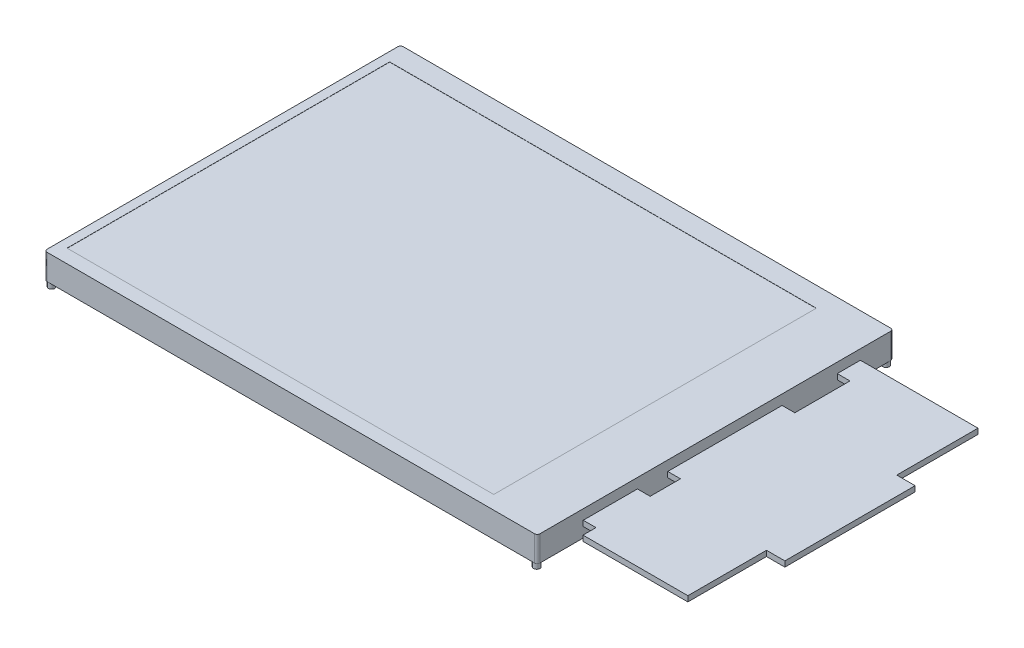
ISO-10303-21;
HEADER;
FILE_DESCRIPTION(('STEP AP214'),'2;1');
FILE_NAME('part.step','',(''),(''),'','','');
FILE_SCHEMA(('AUTOMOTIVE_DESIGN { 1 0 10303 214 1 1 1 1 }'));
ENDSEC;
DATA;
#1=APPLICATION_CONTEXT('core data for automotive mechanical design processes');
#2=APPLICATION_PROTOCOL_DEFINITION('international standard','automotive_design',2000,#1);
#3=PRODUCT_CONTEXT('',#1,'mechanical');
#4=PRODUCT('Part','Part','',(#3));
#5=PRODUCT_RELATED_PRODUCT_CATEGORY('part','',(#4));
#6=PRODUCT_DEFINITION_FORMATION('','',#4);
#7=PRODUCT_DEFINITION_CONTEXT('part definition',#1,'design');
#8=PRODUCT_DEFINITION('design','',#6,#7);
#9=PRODUCT_DEFINITION_SHAPE('','',#8);
#10=(LENGTH_UNIT() NAMED_UNIT(*) SI_UNIT(.MILLI.,.METRE.));
#11=(NAMED_UNIT(*) PLANE_ANGLE_UNIT() SI_UNIT($,.RADIAN.));
#12=(NAMED_UNIT(*) SI_UNIT($,.STERADIAN.) SOLID_ANGLE_UNIT());
#13=UNCERTAINTY_MEASURE_WITH_UNIT(LENGTH_MEASURE(1.E-05),#10,'distance_accuracy_value','');
#14=(GEOMETRIC_REPRESENTATION_CONTEXT(3) GLOBAL_UNCERTAINTY_ASSIGNED_CONTEXT((#13)) GLOBAL_UNIT_ASSIGNED_CONTEXT((#10,
#11,#12)) REPRESENTATION_CONTEXT('',''));
#15=CARTESIAN_POINT('',(0.,0.,0.));
#16=DIRECTION('',(0.,0.,1.));
#17=DIRECTION('',(1.,0.,0.));
#18=AXIS2_PLACEMENT_3D('',#15,#16,#17);
#19=CARTESIAN_POINT('',(34.5186,1.778,24.9428));
#20=DIRECTION('',(-1.,0.,0.));
#21=DIRECTION('',(0.,0.,1.));
#22=AXIS2_PLACEMENT_3D('',#19,#20,#21);
#23=PLANE('',#22);
#24=DIRECTION('',(0.,0.,-1.));
#25=VECTOR('',#24,1.);
#26=CARTESIAN_POINT('',(34.5186,-1.778,24.9428));
#27=LINE('',#26,#25);
#28=CARTESIAN_POINT('',(34.5186,-1.778,24.5618));
#29=VERTEX_POINT('',#28);
#30=CARTESIAN_POINT('',(34.5186,-1.778,-24.5618));
#31=VERTEX_POINT('',#30);
#32=EDGE_CURVE('E390',#29,#31,#27,.T.);
#33=ORIENTED_EDGE('',*,*,#32,.T.);
#34=DIRECTION('',(0.,-1.,0.));
#35=VECTOR('',#34,1.);
#36=CARTESIAN_POINT('',(34.5186,1.778,-24.5618));
#37=LINE('',#36,#35);
#38=CARTESIAN_POINT('',(34.5186,1.778,-24.5618));
#39=VERTEX_POINT('',#38);
#40=EDGE_CURVE('E410',#31,#39,#37,.F.);
#41=ORIENTED_EDGE('',*,*,#40,.T.);
#42=DIRECTION('',(0.,0.,-1.));
#43=VECTOR('',#42,1.);
#44=CARTESIAN_POINT('',(34.5186,1.778,24.9428));
#45=LINE('',#44,#43);
#46=CARTESIAN_POINT('',(34.5186,1.778,24.5618));
#47=VERTEX_POINT('',#46);
#48=EDGE_CURVE('E397',#47,#39,#45,.T.);
#49=ORIENTED_EDGE('',*,*,#48,.F.);
#50=DIRECTION('',(0.,-1.,0.));
#51=VECTOR('',#50,1.);
#52=CARTESIAN_POINT('',(34.5186,1.778,24.5618));
#53=LINE('',#52,#51);
#54=EDGE_CURVE('E421',#47,#29,#53,.T.);
#55=ORIENTED_EDGE('',*,*,#54,.T.);
#56=EDGE_LOOP('',(#33,#41,#49,#55));
#57=FACE_BOUND('',#56,.T.);
#58=DIRECTION('',(0.,0.,1.));
#59=VECTOR('',#58,1.);
#60=CARTESIAN_POINT('',(34.5186,-0.381,-20.32));
#61=LINE('',#60,#59);
#62=CARTESIAN_POINT('',(34.5186,-0.381,10.9099458595665));
#63=VERTEX_POINT('',#62);
#64=CARTESIAN_POINT('',(34.5186,-0.381,18.5002357513767));
#65=VERTEX_POINT('',#64);
#66=EDGE_CURVE('E308',#63,#65,#61,.T.);
#67=ORIENTED_EDGE('',*,*,#66,.T.);
#68=DIRECTION('',(0.,1.,0.));
#69=VECTOR('',#68,1.);
#70=CARTESIAN_POINT('',(34.5186,-2.54,18.5002357513767));
#71=LINE('',#70,#69);
#72=CARTESIAN_POINT('',(34.5186,0.381,18.5002357513767));
#73=VERTEX_POINT('',#72);
#74=EDGE_CURVE('E280',#65,#73,#71,.T.);
#75=ORIENTED_EDGE('',*,*,#74,.T.);
#76=DIRECTION('',(0.,0.,1.));
#77=VECTOR('',#76,1.);
#78=CARTESIAN_POINT('',(34.5186,0.381,-20.32));
#79=LINE('',#78,#77);
#80=CARTESIAN_POINT('',(34.5186,0.381,10.9099458595665));
#81=VERTEX_POINT('',#80);
#82=EDGE_CURVE('E317',#81,#73,#79,.T.);
#83=ORIENTED_EDGE('',*,*,#82,.F.);
#84=DIRECTION('',(0.,1.,0.));
#85=VECTOR('',#84,1.);
#86=CARTESIAN_POINT('',(34.5186,-2.54,10.9099458595665));
#87=LINE('',#86,#85);
#88=EDGE_CURVE('E47',#63,#81,#87,.T.);
#89=ORIENTED_EDGE('',*,*,#88,.F.);
#90=EDGE_LOOP('',(#67,#75,#83,#89));
#91=FACE_BOUND('',#90,.T.);
#92=CARTESIAN_POINT('',(34.5186,-0.381,-9.35403908095458));
#93=VERTEX_POINT('',#92);
#94=CARTESIAN_POINT('',(34.5186,-0.381,6.66216894763594));
#95=VERTEX_POINT('',#94);
#96=EDGE_CURVE('E330',#93,#95,#61,.T.);
#97=ORIENTED_EDGE('',*,*,#96,.T.);
#98=DIRECTION('',(0.,1.,0.));
#99=VECTOR('',#98,1.);
#100=CARTESIAN_POINT('',(34.5186,-2.54,6.66216894763594));
#101=LINE('',#100,#99);
#102=CARTESIAN_POINT('',(34.5186,0.381,6.66216894763594));
#103=VERTEX_POINT('',#102);
#104=EDGE_CURVE('E257',#95,#103,#101,.T.);
#105=ORIENTED_EDGE('',*,*,#104,.T.);
#106=CARTESIAN_POINT('',(34.5186,0.381,-9.35403908095458));
#107=VERTEX_POINT('',#106);
#108=EDGE_CURVE('E316',#107,#103,#79,.T.);
#109=ORIENTED_EDGE('',*,*,#108,.F.);
#110=DIRECTION('',(0.,1.,0.));
#111=VECTOR('',#110,1.);
#112=CARTESIAN_POINT('',(34.5186,-2.54,-9.35403908095458));
#113=LINE('',#112,#111);
#114=EDGE_CURVE('E55',#93,#107,#113,.T.);
#115=ORIENTED_EDGE('',*,*,#114,.F.);
#116=EDGE_LOOP('',(#97,#105,#109,#115));
#117=FACE_BOUND('',#116,.T.);
#118=CARTESIAN_POINT('',(34.5186,-0.381,-20.32));
#119=VERTEX_POINT('',#118);
#120=CARTESIAN_POINT('',(34.5186,-0.381,-17.0836003469265));
#121=VERTEX_POINT('',#120);
#122=EDGE_CURVE('E326',#119,#121,#61,.T.);
#123=ORIENTED_EDGE('',*,*,#122,.T.);
#124=DIRECTION('',(0.,1.,0.));
#125=VECTOR('',#124,1.);
#126=CARTESIAN_POINT('',(34.5186,-2.54,-17.0836003469265));
#127=LINE('',#126,#125);
#128=CARTESIAN_POINT('',(34.5186,0.381,-17.0836003469265));
#129=VERTEX_POINT('',#128);
#130=EDGE_CURVE('E247',#121,#129,#127,.T.);
#131=ORIENTED_EDGE('',*,*,#130,.T.);
#132=CARTESIAN_POINT('',(34.5186,0.381,-20.32));
#133=VERTEX_POINT('',#132);
#134=EDGE_CURVE('E312',#133,#129,#79,.T.);
#135=ORIENTED_EDGE('',*,*,#134,.F.);
#136=DIRECTION('',(0.,-1.,0.));
#137=VECTOR('',#136,1.);
#138=CARTESIAN_POINT('',(34.5186,0.381,-20.32));
#139=LINE('',#138,#137);
#140=EDGE_CURVE('E325',#133,#119,#139,.T.);
#141=ORIENTED_EDGE('',*,*,#140,.T.);
#142=EDGE_LOOP('',(#123,#131,#135,#141));
#143=FACE_BOUND('',#142,.T.);
#144=ADVANCED_FACE('F32',(#57,#91,#117,#143),#23,.F.);
#145=CARTESIAN_POINT('',(-34.5186,1.778,-24.9428));
#146=DIRECTION('',(0.,0.,1.));
#147=DIRECTION('',(1.,0.,0.));
#148=AXIS2_PLACEMENT_3D('',#145,#146,#147);
#149=PLANE('',#148);
#150=DIRECTION('',(-1.,0.,0.));
#151=VECTOR('',#150,1.);
#152=CARTESIAN_POINT('',(-34.5186,1.778,-24.9428));
#153=LINE('',#152,#151);
#154=CARTESIAN_POINT('',(34.1376,1.778,-24.9428));
#155=VERTEX_POINT('',#154);
#156=CARTESIAN_POINT('',(-34.1376,1.778,-24.9428));
#157=VERTEX_POINT('',#156);
#158=EDGE_CURVE('E400',#155,#157,#153,.T.);
#159=ORIENTED_EDGE('',*,*,#158,.F.);
#160=DIRECTION('',(0.,-1.,0.));
#161=VECTOR('',#160,1.);
#162=CARTESIAN_POINT('',(34.1376,1.778,-24.9428));
#163=LINE('',#162,#161);
#164=CARTESIAN_POINT('',(34.1376,-1.778,-24.9428));
#165=VERTEX_POINT('',#164);
#166=EDGE_CURVE('E448',#155,#165,#163,.T.);
#167=ORIENTED_EDGE('',*,*,#166,.T.);
#168=DIRECTION('',(-1.,0.,0.));
#169=VECTOR('',#168,1.);
#170=CARTESIAN_POINT('',(-34.5186,-1.778,-24.9428));
#171=LINE('',#170,#169);
#172=CARTESIAN_POINT('',(-34.1376,-1.778,-24.9428));
#173=VERTEX_POINT('',#172);
#174=EDGE_CURVE('E412',#165,#173,#171,.T.);
#175=ORIENTED_EDGE('',*,*,#174,.T.);
#176=DIRECTION('',(0.,-1.,0.));
#177=VECTOR('',#176,1.);
#178=CARTESIAN_POINT('',(-34.1376,1.778,-24.9428));
#179=LINE('',#178,#177);
#180=EDGE_CURVE('E446',#173,#157,#179,.F.);
#181=ORIENTED_EDGE('',*,*,#180,.T.);
#182=EDGE_LOOP('',(#159,#167,#175,#181));
#183=FACE_BOUND('',#182,.T.);
#184=ADVANCED_FACE('F552',(#183),#149,.F.);
#185=CARTESIAN_POINT('',(-34.5186,1.778,24.9428));
#186=DIRECTION('',(1.,0.,0.));
#187=DIRECTION('',(0.,0.,-1.));
#188=AXIS2_PLACEMENT_3D('',#185,#186,#187);
#189=PLANE('',#188);
#190=DIRECTION('',(0.,0.,1.));
#191=VECTOR('',#190,1.);
#192=CARTESIAN_POINT('',(-34.5186,1.778,24.9428));
#193=LINE('',#192,#191);
#194=CARTESIAN_POINT('',(-34.5186,1.778,-24.5618));
#195=VERTEX_POINT('',#194);
#196=CARTESIAN_POINT('',(-34.5186,1.778,24.5618));
#197=VERTEX_POINT('',#196);
#198=EDGE_CURVE('E404',#195,#197,#193,.T.);
#199=ORIENTED_EDGE('',*,*,#198,.F.);
#200=DIRECTION('',(0.,-1.,0.));
#201=VECTOR('',#200,1.);
#202=CARTESIAN_POINT('',(-34.5186,1.778,-24.5618));
#203=LINE('',#202,#201);
#204=CARTESIAN_POINT('',(-34.5186,-1.778,-24.5618));
#205=VERTEX_POINT('',#204);
#206=EDGE_CURVE('E453',#195,#205,#203,.T.);
#207=ORIENTED_EDGE('',*,*,#206,.T.);
#208=DIRECTION('',(0.,0.,1.));
#209=VECTOR('',#208,1.);
#210=CARTESIAN_POINT('',(-34.5186,-1.778,24.9428));
#211=LINE('',#210,#209);
#212=CARTESIAN_POINT('',(-34.5186,-1.778,24.5618));
#213=VERTEX_POINT('',#212);
#214=EDGE_CURVE('E415',#205,#213,#211,.T.);
#215=ORIENTED_EDGE('',*,*,#214,.T.);
#216=DIRECTION('',(0.,-1.,0.));
#217=VECTOR('',#216,1.);
#218=CARTESIAN_POINT('',(-34.5186,1.778,24.5618));
#219=LINE('',#218,#217);
#220=EDGE_CURVE('E451',#213,#197,#219,.F.);
#221=ORIENTED_EDGE('',*,*,#220,.T.);
#222=EDGE_LOOP('',(#199,#207,#215,#221));
#223=FACE_BOUND('',#222,.T.);
#224=ADVANCED_FACE('F558',(#223),#189,.F.);
#225=CARTESIAN_POINT('',(-34.5186,1.778,24.9428));
#226=DIRECTION('',(0.,0.,-1.));
#227=DIRECTION('',(-1.,0.,0.));
#228=AXIS2_PLACEMENT_3D('',#225,#226,#227);
#229=PLANE('',#228);
#230=DIRECTION('',(1.,0.,0.));
#231=VECTOR('',#230,1.);
#232=CARTESIAN_POINT('',(-34.5186,-1.778,24.9428));
#233=LINE('',#232,#231);
#234=CARTESIAN_POINT('',(-34.1376,-1.778,24.9428));
#235=VERTEX_POINT('',#234);
#236=CARTESIAN_POINT('',(34.1376,-1.778,24.9428));
#237=VERTEX_POINT('',#236);
#238=EDGE_CURVE('E401',#235,#237,#233,.T.);
#239=ORIENTED_EDGE('',*,*,#238,.T.);
#240=DIRECTION('',(0.,-1.,0.));
#241=VECTOR('',#240,1.);
#242=CARTESIAN_POINT('',(34.1376,1.778,24.9428));
#243=LINE('',#242,#241);
#244=CARTESIAN_POINT('',(34.1376,1.778,24.9428));
#245=VERTEX_POINT('',#244);
#246=EDGE_CURVE('E436',#237,#245,#243,.F.);
#247=ORIENTED_EDGE('',*,*,#246,.T.);
#248=DIRECTION('',(1.,0.,0.));
#249=VECTOR('',#248,1.);
#250=CARTESIAN_POINT('',(-34.5186,1.778,24.9428));
#251=LINE('',#250,#249);
#252=CARTESIAN_POINT('',(-34.1376,1.778,24.9428));
#253=VERTEX_POINT('',#252);
#254=EDGE_CURVE('E407',#253,#245,#251,.T.);
#255=ORIENTED_EDGE('',*,*,#254,.F.);
#256=DIRECTION('',(0.,-1.,0.));
#257=VECTOR('',#256,1.);
#258=CARTESIAN_POINT('',(-34.1376,1.778,24.9428));
#259=LINE('',#258,#257);
#260=EDGE_CURVE('E433',#253,#235,#259,.T.);
#261=ORIENTED_EDGE('',*,*,#260,.T.);
#262=EDGE_LOOP('',(#239,#247,#255,#261));
#263=FACE_BOUND('',#262,.T.);
#264=ADVANCED_FACE('F594',(#263),#229,.F.);
#265=CARTESIAN_POINT('',(0.,1.778,0.));
#266=DIRECTION('',(0.,-1.,0.));
#267=DIRECTION('',(0.,0.,-1.));
#268=AXIS2_PLACEMENT_3D('',#265,#266,#267);
#269=PLANE('',#268);
#270=DIRECTION('',(-1.,0.,0.));
#271=VECTOR('',#270,1.);
#272=CARTESIAN_POINT('',(26.5176,1.778,-22.1488));
#273=LINE('',#272,#271);
#274=CARTESIAN_POINT('',(26.5176,1.778,-22.1488));
#275=VERTEX_POINT('',#274);
#276=CARTESIAN_POINT('',(-33.2486,1.778,-22.1488));
#277=VERTEX_POINT('',#276);
#278=EDGE_CURVE('E380',#275,#277,#273,.T.);
#279=ORIENTED_EDGE('',*,*,#278,.F.);
#280=DIRECTION('',(0.,0.,-1.));
#281=VECTOR('',#280,1.);
#282=CARTESIAN_POINT('',(26.5176,1.778,23.0378));
#283=LINE('',#282,#281);
#284=CARTESIAN_POINT('',(26.5176,1.778,23.0378));
#285=VERTEX_POINT('',#284);
#286=EDGE_CURVE('E362',#285,#275,#283,.T.);
#287=ORIENTED_EDGE('',*,*,#286,.F.);
#288=DIRECTION('',(1.,0.,0.));
#289=VECTOR('',#288,1.);
#290=CARTESIAN_POINT('',(26.5176,1.778,23.0378));
#291=LINE('',#290,#289);
#292=CARTESIAN_POINT('',(-33.2486,1.778,23.0378));
#293=VERTEX_POINT('',#292);
#294=EDGE_CURVE('E369',#293,#285,#291,.T.);
#295=ORIENTED_EDGE('',*,*,#294,.F.);
#296=DIRECTION('',(0.,0.,1.));
#297=VECTOR('',#296,1.);
#298=CARTESIAN_POINT('',(-33.2486,1.778,23.0378));
#299=LINE('',#298,#297);
#300=EDGE_CURVE('E383',#277,#293,#299,.T.);
#301=ORIENTED_EDGE('',*,*,#300,.F.);
#302=EDGE_LOOP('',(#279,#287,#295,#301));
#303=FACE_BOUND('',#302,.T.);
#304=ORIENTED_EDGE('',*,*,#254,.T.);
#305=CARTESIAN_POINT('',(34.1376,1.778,24.5618));
#306=DIRECTION('',(0.,-1.,0.));
#307=DIRECTION('',(0.,0.,-1.));
#308=AXIS2_PLACEMENT_3D('',#305,#306,#307);
#309=CIRCLE('',#308,0.381);
#310=EDGE_CURVE('E444',#245,#47,#309,.F.);
#311=ORIENTED_EDGE('',*,*,#310,.T.);
#312=ORIENTED_EDGE('',*,*,#48,.T.);
#313=CARTESIAN_POINT('',(34.1376,1.778,-24.5618));
#314=DIRECTION('',(0.,-1.,0.));
#315=DIRECTION('',(0.,0.,-1.));
#316=AXIS2_PLACEMENT_3D('',#313,#314,#315);
#317=CIRCLE('',#316,0.381);
#318=EDGE_CURVE('E442',#39,#155,#317,.F.);
#319=ORIENTED_EDGE('',*,*,#318,.T.);
#320=ORIENTED_EDGE('',*,*,#158,.T.);
#321=CARTESIAN_POINT('',(-34.1376,1.778,-24.5618));
#322=DIRECTION('',(0.,-1.,0.));
#323=DIRECTION('',(0.,0.,-1.));
#324=AXIS2_PLACEMENT_3D('',#321,#322,#323);
#325=CIRCLE('',#324,0.381);
#326=EDGE_CURVE('E440',#157,#195,#325,.F.);
#327=ORIENTED_EDGE('',*,*,#326,.T.);
#328=ORIENTED_EDGE('',*,*,#198,.T.);
#329=CARTESIAN_POINT('',(-34.1376,1.778,24.5618));
#330=DIRECTION('',(0.,-1.,0.));
#331=DIRECTION('',(0.,0.,-1.));
#332=AXIS2_PLACEMENT_3D('',#329,#330,#331);
#333=CIRCLE('',#332,0.381);
#334=EDGE_CURVE('E438',#197,#253,#333,.F.);
#335=ORIENTED_EDGE('',*,*,#334,.T.);
#336=EDGE_LOOP('',(#304,#311,#312,#319,#320,#327,#328,#335));
#337=FACE_BOUND('',#336,.T.);
#338=ADVANCED_FACE('F584',(#303,#337),#269,.F.);
#339=CARTESIAN_POINT('',(0.,-1.778,0.));
#340=DIRECTION('',(0.,-1.,0.));
#341=DIRECTION('',(0.,0.,-1.));
#342=AXIS2_PLACEMENT_3D('',#339,#340,#341);
#343=PLANE('',#342);
#344=CARTESIAN_POINT('',(-33.9725,-1.778,-24.4729));
#345=DIRECTION('',(0.,-1.,0.));
#346=DIRECTION('',(0.,0.,-1.));
#347=AXIS2_PLACEMENT_3D('',#344,#345,#346);
#348=CIRCLE('',#347,0.444500000000001);
#349=CARTESIAN_POINT('',(-33.9725,-1.778,-24.9174));
#350=VERTEX_POINT('',#349);
#351=EDGE_CURVE('E340',#350,#350,#348,.T.);
#352=ORIENTED_EDGE('',*,*,#351,.F.);
#353=EDGE_LOOP('',(#352));
#354=FACE_BOUND('',#353,.T.);
#355=CARTESIAN_POINT('',(33.9725,-1.778,-24.4729));
#356=DIRECTION('',(0.,-1.,0.));
#357=DIRECTION('',(0.,0.,-1.));
#358=AXIS2_PLACEMENT_3D('',#355,#356,#357);
#359=CIRCLE('',#358,0.444500000000001);
#360=CARTESIAN_POINT('',(33.9725,-1.778,-24.9174));
#361=VERTEX_POINT('',#360);
#362=EDGE_CURVE('E344',#361,#361,#359,.T.);
#363=ORIENTED_EDGE('',*,*,#362,.F.);
#364=EDGE_LOOP('',(#363));
#365=FACE_BOUND('',#364,.T.);
#366=CARTESIAN_POINT('',(33.9725,-1.778,24.4729));
#367=DIRECTION('',(0.,-1.,0.));
#368=DIRECTION('',(0.,0.,-1.));
#369=AXIS2_PLACEMENT_3D('',#366,#367,#368);
#370=CIRCLE('',#369,0.444500000000001);
#371=CARTESIAN_POINT('',(33.9725,-1.778,24.0284));
#372=VERTEX_POINT('',#371);
#373=EDGE_CURVE('E350',#372,#372,#370,.T.);
#374=ORIENTED_EDGE('',*,*,#373,.F.);
#375=EDGE_LOOP('',(#374));
#376=FACE_BOUND('',#375,.T.);
#377=CARTESIAN_POINT('',(-33.9725,-1.778,24.4729));
#378=DIRECTION('',(0.,-1.,0.));
#379=DIRECTION('',(0.,0.,-1.));
#380=AXIS2_PLACEMENT_3D('',#377,#378,#379);
#381=CIRCLE('',#380,0.444500000000001);
#382=CARTESIAN_POINT('',(-33.9725,-1.778,24.0284));
#383=VERTEX_POINT('',#382);
#384=EDGE_CURVE('E356',#383,#383,#381,.T.);
#385=ORIENTED_EDGE('',*,*,#384,.F.);
#386=EDGE_LOOP('',(#385));
#387=FACE_BOUND('',#386,.T.);
#388=ORIENTED_EDGE('',*,*,#32,.F.);
#389=CARTESIAN_POINT('',(34.1376,-1.778,24.5618));
#390=DIRECTION('',(0.,-1.,0.));
#391=DIRECTION('',(0.,0.,-1.));
#392=AXIS2_PLACEMENT_3D('',#389,#390,#391);
#393=CIRCLE('',#392,0.381);
#394=EDGE_CURVE('E431',#29,#237,#393,.T.);
#395=ORIENTED_EDGE('',*,*,#394,.T.);
#396=ORIENTED_EDGE('',*,*,#238,.F.);
#397=CARTESIAN_POINT('',(-34.1376,-1.778,24.5618));
#398=DIRECTION('',(0.,-1.,0.));
#399=DIRECTION('',(0.,0.,-1.));
#400=AXIS2_PLACEMENT_3D('',#397,#398,#399);
#401=CIRCLE('',#400,0.381);
#402=EDGE_CURVE('E424',#235,#213,#401,.T.);
#403=ORIENTED_EDGE('',*,*,#402,.T.);
#404=ORIENTED_EDGE('',*,*,#214,.F.);
#405=CARTESIAN_POINT('',(-34.1376,-1.778,-24.5618));
#406=DIRECTION('',(0.,-1.,0.));
#407=DIRECTION('',(0.,0.,-1.));
#408=AXIS2_PLACEMENT_3D('',#405,#406,#407);
#409=CIRCLE('',#408,0.381);
#410=EDGE_CURVE('E426',#205,#173,#409,.T.);
#411=ORIENTED_EDGE('',*,*,#410,.T.);
#412=ORIENTED_EDGE('',*,*,#174,.F.);
#413=CARTESIAN_POINT('',(34.1376,-1.778,-24.5618));
#414=DIRECTION('',(0.,-1.,0.));
#415=DIRECTION('',(0.,0.,-1.));
#416=AXIS2_PLACEMENT_3D('',#413,#414,#415);
#417=CIRCLE('',#416,0.381);
#418=EDGE_CURVE('E428',#165,#31,#417,.T.);
#419=ORIENTED_EDGE('',*,*,#418,.T.);
#420=EDGE_LOOP('',(#388,#395,#396,#403,#404,#411,#412,#419));
#421=FACE_BOUND('',#420,.T.);
#422=ADVANCED_FACE('F567',(#354,#365,#376,#387,#421),#343,.T.);
#423=CARTESIAN_POINT('',(34.1376,1.778,24.5618));
#424=DIRECTION('',(0.,-1.,0.));
#425=DIRECTION('',(0.,0.,-1.));
#426=AXIS2_PLACEMENT_3D('',#423,#424,#425);
#427=CYLINDRICAL_SURFACE('',#426,0.381);
#428=ORIENTED_EDGE('',*,*,#310,.F.);
#429=ORIENTED_EDGE('',*,*,#246,.F.);
#430=ORIENTED_EDGE('',*,*,#394,.F.);
#431=ORIENTED_EDGE('',*,*,#54,.F.);
#432=EDGE_LOOP('',(#428,#429,#430,#431));
#433=FACE_BOUND('',#432,.T.);
#434=ADVANCED_FACE('F563',(#433),#427,.T.);
#435=CARTESIAN_POINT('',(34.1376,1.778,-24.5618));
#436=DIRECTION('',(0.,-1.,0.));
#437=DIRECTION('',(0.,0.,-1.));
#438=AXIS2_PLACEMENT_3D('',#435,#436,#437);
#439=CYLINDRICAL_SURFACE('',#438,0.381);
#440=ORIENTED_EDGE('',*,*,#318,.F.);
#441=ORIENTED_EDGE('',*,*,#40,.F.);
#442=ORIENTED_EDGE('',*,*,#418,.F.);
#443=ORIENTED_EDGE('',*,*,#166,.F.);
#444=EDGE_LOOP('',(#440,#441,#442,#443));
#445=FACE_BOUND('',#444,.T.);
#446=ADVANCED_FACE('F566',(#445),#439,.T.);
#447=CARTESIAN_POINT('',(-34.1376,1.778,-24.5618));
#448=DIRECTION('',(0.,-1.,0.));
#449=DIRECTION('',(0.,0.,-1.));
#450=AXIS2_PLACEMENT_3D('',#447,#448,#449);
#451=CYLINDRICAL_SURFACE('',#450,0.381);
#452=ORIENTED_EDGE('',*,*,#326,.F.);
#453=ORIENTED_EDGE('',*,*,#180,.F.);
#454=ORIENTED_EDGE('',*,*,#410,.F.);
#455=ORIENTED_EDGE('',*,*,#206,.F.);
#456=EDGE_LOOP('',(#452,#453,#454,#455));
#457=FACE_BOUND('',#456,.T.);
#458=ADVANCED_FACE('F570',(#457),#451,.T.);
#459=CARTESIAN_POINT('',(-34.1376,1.778,24.5618));
#460=DIRECTION('',(0.,-1.,0.));
#461=DIRECTION('',(0.,0.,-1.));
#462=AXIS2_PLACEMENT_3D('',#459,#460,#461);
#463=CYLINDRICAL_SURFACE('',#462,0.381);
#464=ORIENTED_EDGE('',*,*,#334,.F.);
#465=ORIENTED_EDGE('',*,*,#220,.F.);
#466=ORIENTED_EDGE('',*,*,#402,.F.);
#467=ORIENTED_EDGE('',*,*,#260,.F.);
#468=EDGE_LOOP('',(#464,#465,#466,#467));
#469=FACE_BOUND('',#468,.T.);
#470=ADVANCED_FACE('F34',(#469),#463,.T.);
#471=CARTESIAN_POINT('',(26.5176,1.7526,23.0378));
#472=DIRECTION('',(1.,0.,0.));
#473=DIRECTION('',(0.,0.,-1.));
#474=AXIS2_PLACEMENT_3D('',#471,#472,#473);
#475=PLANE('',#474);
#476=ORIENTED_EDGE('',*,*,#286,.T.);
#477=DIRECTION('',(0.,1.,0.));
#478=VECTOR('',#477,1.);
#479=CARTESIAN_POINT('',(26.5176,1.7526,-22.1488));
#480=LINE('',#479,#478);
#481=CARTESIAN_POINT('',(26.5176,1.7526,-22.1488));
#482=VERTEX_POINT('',#481);
#483=EDGE_CURVE('E378',#482,#275,#480,.T.);
#484=ORIENTED_EDGE('',*,*,#483,.F.);
#485=DIRECTION('',(0.,0.,-1.));
#486=VECTOR('',#485,1.);
#487=CARTESIAN_POINT('',(26.5176,1.7526,23.0378));
#488=LINE('',#487,#486);
#489=CARTESIAN_POINT('',(26.5176,1.7526,23.0378));
#490=VERTEX_POINT('',#489);
#491=EDGE_CURVE('E365',#490,#482,#488,.T.);
#492=ORIENTED_EDGE('',*,*,#491,.F.);
#493=DIRECTION('',(0.,1.,0.));
#494=VECTOR('',#493,1.);
#495=CARTESIAN_POINT('',(26.5176,1.7526,23.0378));
#496=LINE('',#495,#494);
#497=EDGE_CURVE('E388',#490,#285,#496,.T.);
#498=ORIENTED_EDGE('',*,*,#497,.T.);
#499=EDGE_LOOP('',(#476,#484,#492,#498));
#500=FACE_BOUND('',#499,.T.);
#501=ADVANCED_FACE('F577',(#500),#475,.F.);
#502=CARTESIAN_POINT('',(26.5176,1.7526,23.0378));
#503=DIRECTION('',(0.,0.,1.));
#504=DIRECTION('',(1.,0.,0.));
#505=AXIS2_PLACEMENT_3D('',#502,#503,#504);
#506=PLANE('',#505);
#507=ORIENTED_EDGE('',*,*,#294,.T.);
#508=ORIENTED_EDGE('',*,*,#497,.F.);
#509=DIRECTION('',(1.,0.,0.));
#510=VECTOR('',#509,1.);
#511=CARTESIAN_POINT('',(26.5176,1.7526,23.0378));
#512=LINE('',#511,#510);
#513=CARTESIAN_POINT('',(-33.2486,1.7526,23.0378));
#514=VERTEX_POINT('',#513);
#515=EDGE_CURVE('E375',#514,#490,#512,.T.);
#516=ORIENTED_EDGE('',*,*,#515,.F.);
#517=DIRECTION('',(0.,1.,0.));
#518=VECTOR('',#517,1.);
#519=CARTESIAN_POINT('',(-33.2486,1.7526,23.0378));
#520=LINE('',#519,#518);
#521=EDGE_CURVE('E391',#514,#293,#520,.T.);
#522=ORIENTED_EDGE('',*,*,#521,.T.);
#523=EDGE_LOOP('',(#507,#508,#516,#522));
#524=FACE_BOUND('',#523,.T.);
#525=ADVANCED_FACE('F645',(#524),#506,.F.);
#526=CARTESIAN_POINT('',(-33.2486,1.7526,23.0378));
#527=DIRECTION('',(-1.,0.,0.));
#528=DIRECTION('',(0.,0.,1.));
#529=AXIS2_PLACEMENT_3D('',#526,#527,#528);
#530=PLANE('',#529);
#531=ORIENTED_EDGE('',*,*,#300,.T.);
#532=ORIENTED_EDGE('',*,*,#521,.F.);
#533=DIRECTION('',(0.,0.,1.));
#534=VECTOR('',#533,1.);
#535=CARTESIAN_POINT('',(-33.2486,1.7526,23.0378));
#536=LINE('',#535,#534);
#537=CARTESIAN_POINT('',(-33.2486,1.7526,-22.1488));
#538=VERTEX_POINT('',#537);
#539=EDGE_CURVE('E372',#538,#514,#536,.T.);
#540=ORIENTED_EDGE('',*,*,#539,.F.);
#541=DIRECTION('',(0.,1.,0.));
#542=VECTOR('',#541,1.);
#543=CARTESIAN_POINT('',(-33.2486,1.7526,-22.1488));
#544=LINE('',#543,#542);
#545=EDGE_CURVE('E393',#538,#277,#544,.T.);
#546=ORIENTED_EDGE('',*,*,#545,.T.);
#547=EDGE_LOOP('',(#531,#532,#540,#546));
#548=FACE_BOUND('',#547,.T.);
#549=ADVANCED_FACE('F654',(#548),#530,.F.);
#550=CARTESIAN_POINT('',(26.5176,1.7526,-22.1488));
#551=DIRECTION('',(0.,0.,-1.));
#552=DIRECTION('',(-1.,0.,0.));
#553=AXIS2_PLACEMENT_3D('',#550,#551,#552);
#554=PLANE('',#553);
#555=ORIENTED_EDGE('',*,*,#278,.T.);
#556=ORIENTED_EDGE('',*,*,#545,.F.);
#557=DIRECTION('',(-1.,0.,0.));
#558=VECTOR('',#557,1.);
#559=CARTESIAN_POINT('',(26.5176,1.7526,-22.1488));
#560=LINE('',#559,#558);
#561=EDGE_CURVE('E368',#482,#538,#560,.T.);
#562=ORIENTED_EDGE('',*,*,#561,.F.);
#563=ORIENTED_EDGE('',*,*,#483,.T.);
#564=EDGE_LOOP('',(#555,#556,#562,#563));
#565=FACE_BOUND('',#564,.T.);
#566=ADVANCED_FACE('F664',(#565),#554,.F.);
#567=CARTESIAN_POINT('',(0.,1.7526,0.));
#568=DIRECTION('',(0.,1.,0.));
#569=DIRECTION('',(0.,0.,1.));
#570=AXIS2_PLACEMENT_3D('',#567,#568,#569);
#571=PLANE('',#570);
#572=ORIENTED_EDGE('',*,*,#491,.T.);
#573=ORIENTED_EDGE('',*,*,#561,.T.);
#574=ORIENTED_EDGE('',*,*,#539,.T.);
#575=ORIENTED_EDGE('',*,*,#515,.T.);
#576=EDGE_LOOP('',(#572,#573,#574,#575));
#577=FACE_BOUND('',#576,.T.);
#578=ADVANCED_FACE('F674',(#577),#571,.T.);
#579=CARTESIAN_POINT('',(-33.9725,-2.54,24.4729));
#580=DIRECTION('',(0.,1.,0.));
#581=DIRECTION('',(0.,0.,1.));
#582=AXIS2_PLACEMENT_3D('',#579,#580,#581);
#583=CYLINDRICAL_SURFACE('',#582,0.444500000000001);
#584=CARTESIAN_POINT('',(-33.9725,-2.54,24.4729));
#585=DIRECTION('',(0.,-1.,0.));
#586=DIRECTION('',(0.,0.,-1.));
#587=AXIS2_PLACEMENT_3D('',#584,#585,#586);
#588=CIRCLE('',#587,0.444500000000001);
#589=CARTESIAN_POINT('',(-33.9725,-2.54,24.0284));
#590=VERTEX_POINT('',#589);
#591=EDGE_CURVE('E359',#590,#590,#588,.T.);
#592=ORIENTED_EDGE('',*,*,#591,.F.);
#593=EDGE_LOOP('',(#592));
#594=FACE_BOUND('',#593,.T.);
#595=ORIENTED_EDGE('',*,*,#384,.T.);
#596=EDGE_LOOP('',(#595));
#597=FACE_BOUND('',#596,.T.);
#598=ADVANCED_FACE('F684',(#594,#597),#583,.T.);
#599=CARTESIAN_POINT('',(-33.9725,-2.54,24.4729));
#600=DIRECTION('',(0.,-1.,0.));
#601=DIRECTION('',(0.,0.,-1.));
#602=AXIS2_PLACEMENT_3D('',#599,#600,#601);
#603=PLANE('',#602);
#604=ORIENTED_EDGE('',*,*,#591,.T.);
#605=EDGE_LOOP('',(#604));
#606=FACE_BOUND('',#605,.T.);
#607=ADVANCED_FACE('F694',(#606),#603,.T.);
#608=CARTESIAN_POINT('',(33.9725,-2.54,24.4729));
#609=DIRECTION('',(0.,1.,0.));
#610=DIRECTION('',(0.,0.,1.));
#611=AXIS2_PLACEMENT_3D('',#608,#609,#610);
#612=CYLINDRICAL_SURFACE('',#611,0.444500000000001);
#613=CARTESIAN_POINT('',(33.9725,-2.54,24.4729));
#614=DIRECTION('',(0.,-1.,0.));
#615=DIRECTION('',(0.,0.,-1.));
#616=AXIS2_PLACEMENT_3D('',#613,#614,#615);
#617=CIRCLE('',#616,0.444500000000001);
#618=CARTESIAN_POINT('',(33.9725,-2.54,24.0284));
#619=VERTEX_POINT('',#618);
#620=EDGE_CURVE('E353',#619,#619,#617,.T.);
#621=ORIENTED_EDGE('',*,*,#620,.F.);
#622=EDGE_LOOP('',(#621));
#623=FACE_BOUND('',#622,.T.);
#624=ORIENTED_EDGE('',*,*,#373,.T.);
#625=EDGE_LOOP('',(#624));
#626=FACE_BOUND('',#625,.T.);
#627=ADVANCED_FACE('F704',(#623,#626),#612,.T.);
#628=CARTESIAN_POINT('',(33.9725,-2.54,24.4729));
#629=DIRECTION('',(0.,-1.,0.));
#630=DIRECTION('',(0.,0.,-1.));
#631=AXIS2_PLACEMENT_3D('',#628,#629,#630);
#632=PLANE('',#631);
#633=ORIENTED_EDGE('',*,*,#620,.T.);
#634=EDGE_LOOP('',(#633));
#635=FACE_BOUND('',#634,.T.);
#636=ADVANCED_FACE('F714',(#635),#632,.T.);
#637=CARTESIAN_POINT('',(33.9725,-2.54,-24.4729));
#638=DIRECTION('',(0.,1.,0.));
#639=DIRECTION('',(0.,0.,1.));
#640=AXIS2_PLACEMENT_3D('',#637,#638,#639);
#641=CYLINDRICAL_SURFACE('',#640,0.444500000000001);
#642=CARTESIAN_POINT('',(33.9725,-2.54,-24.4729));
#643=DIRECTION('',(0.,-1.,0.));
#644=DIRECTION('',(0.,0.,-1.));
#645=AXIS2_PLACEMENT_3D('',#642,#643,#644);
#646=CIRCLE('',#645,0.444500000000001);
#647=CARTESIAN_POINT('',(33.9725,-2.54,-24.9174));
#648=VERTEX_POINT('',#647);
#649=EDGE_CURVE('E347',#648,#648,#646,.T.);
#650=ORIENTED_EDGE('',*,*,#649,.F.);
#651=EDGE_LOOP('',(#650));
#652=FACE_BOUND('',#651,.T.);
#653=ORIENTED_EDGE('',*,*,#362,.T.);
#654=EDGE_LOOP('',(#653));
#655=FACE_BOUND('',#654,.T.);
#656=ADVANCED_FACE('F724',(#652,#655),#641,.T.);
#657=CARTESIAN_POINT('',(33.9725,-2.54,-24.4729));
#658=DIRECTION('',(0.,-1.,0.));
#659=DIRECTION('',(0.,0.,-1.));
#660=AXIS2_PLACEMENT_3D('',#657,#658,#659);
#661=PLANE('',#660);
#662=ORIENTED_EDGE('',*,*,#649,.T.);
#663=EDGE_LOOP('',(#662));
#664=FACE_BOUND('',#663,.T.);
#665=ADVANCED_FACE('F734',(#664),#661,.T.);
#666=CARTESIAN_POINT('',(-33.9725,-2.54,-24.4729));
#667=DIRECTION('',(0.,1.,0.));
#668=DIRECTION('',(0.,0.,1.));
#669=AXIS2_PLACEMENT_3D('',#666,#667,#668);
#670=CYLINDRICAL_SURFACE('',#669,0.444500000000001);
#671=CARTESIAN_POINT('',(-33.9725,-2.54,-24.4729));
#672=DIRECTION('',(0.,-1.,0.));
#673=DIRECTION('',(0.,0.,-1.));
#674=AXIS2_PLACEMENT_3D('',#671,#672,#673);
#675=CIRCLE('',#674,0.444500000000001);
#676=CARTESIAN_POINT('',(-33.9725,-2.54,-24.9174));
#677=VERTEX_POINT('',#676);
#678=EDGE_CURVE('E341',#677,#677,#675,.T.);
#679=ORIENTED_EDGE('',*,*,#678,.F.);
#680=EDGE_LOOP('',(#679));
#681=FACE_BOUND('',#680,.T.);
#682=ORIENTED_EDGE('',*,*,#351,.T.);
#683=EDGE_LOOP('',(#682));
#684=FACE_BOUND('',#683,.T.);
#685=ADVANCED_FACE('F744',(#681,#684),#670,.T.);
#686=CARTESIAN_POINT('',(-33.9725,-2.54,-24.4729));
#687=DIRECTION('',(0.,-1.,0.));
#688=DIRECTION('',(0.,0.,-1.));
#689=AXIS2_PLACEMENT_3D('',#686,#687,#688);
#690=PLANE('',#689);
#691=ORIENTED_EDGE('',*,*,#678,.T.);
#692=EDGE_LOOP('',(#691));
#693=FACE_BOUND('',#692,.T.);
#694=ADVANCED_FACE('F754',(#693),#690,.T.);
#695=CARTESIAN_POINT('',(34.5186,0.381,20.32));
#696=DIRECTION('',(0.,0.,-1.));
#697=DIRECTION('',(-1.,0.,0.));
#698=AXIS2_PLACEMENT_3D('',#695,#696,#697);
#699=PLANE('',#698);
#700=DIRECTION('',(1.,0.,0.));
#701=VECTOR('',#700,1.);
#702=CARTESIAN_POINT('',(34.5186,-0.381,20.32));
#703=LINE('',#702,#701);
#704=CARTESIAN_POINT('',(36.3035184481984,-0.381,20.32));
#705=VERTEX_POINT('',#704);
#706=CARTESIAN_POINT('',(50.9966484222532,-0.381,20.32));
#707=VERTEX_POINT('',#706);
#708=EDGE_CURVE('E329',#705,#707,#703,.T.);
#709=ORIENTED_EDGE('',*,*,#708,.T.);
#710=DIRECTION('',(0.,1.,0.));
#711=VECTOR('',#710,1.);
#712=CARTESIAN_POINT('',(50.9966484222532,-2.54,20.32));
#713=LINE('',#712,#711);
#714=CARTESIAN_POINT('',(50.9966484222532,0.381,20.32));
#715=VERTEX_POINT('',#714);
#716=EDGE_CURVE('E283',#707,#715,#713,.T.);
#717=ORIENTED_EDGE('',*,*,#716,.T.);
#718=DIRECTION('',(1.,0.,0.));
#719=VECTOR('',#718,1.);
#720=CARTESIAN_POINT('',(34.5186,0.381,20.32));
#721=LINE('',#720,#719);
#722=CARTESIAN_POINT('',(36.3035184481984,0.381,20.32));
#723=VERTEX_POINT('',#722);
#724=EDGE_CURVE('E315',#723,#715,#721,.T.);
#725=ORIENTED_EDGE('',*,*,#724,.F.);
#726=DIRECTION('',(0.,1.,0.));
#727=VECTOR('',#726,1.);
#728=CARTESIAN_POINT('',(36.3035184481984,-2.54,20.32));
#729=LINE('',#728,#727);
#730=EDGE_CURVE('E295',#705,#723,#729,.T.);
#731=ORIENTED_EDGE('',*,*,#730,.F.);
#732=EDGE_LOOP('',(#709,#717,#725,#731));
#733=FACE_BOUND('',#732,.T.);
#734=ADVANCED_FACE('F502',(#733),#699,.F.);
#735=CARTESIAN_POINT('',(53.5686,0.381,-20.32));
#736=DIRECTION('',(-1.,0.,0.));
#737=DIRECTION('',(0.,0.,1.));
#738=AXIS2_PLACEMENT_3D('',#735,#736,#737);
#739=PLANE('',#738);
#740=DIRECTION('',(0.,0.,-1.));
#741=VECTOR('',#740,1.);
#742=CARTESIAN_POINT('',(53.5686,0.381,-20.32));
#743=LINE('',#742,#741);
#744=CARTESIAN_POINT('',(53.5686,0.381,9.30832505670741));
#745=VERTEX_POINT('',#744);
#746=CARTESIAN_POINT('',(53.5686,0.381,-8.93622495846961));
#747=VERTEX_POINT('',#746);
#748=EDGE_CURVE('E320',#745,#747,#743,.T.);
#749=ORIENTED_EDGE('',*,*,#748,.F.);
#750=DIRECTION('',(0.,1.,0.));
#751=VECTOR('',#750,1.);
#752=CARTESIAN_POINT('',(53.5686,-2.54,9.30832505670741));
#753=LINE('',#752,#751);
#754=CARTESIAN_POINT('',(53.5686,-0.381,9.30832505670741));
#755=VERTEX_POINT('',#754);
#756=EDGE_CURVE('E282',#755,#745,#753,.T.);
#757=ORIENTED_EDGE('',*,*,#756,.F.);
#758=DIRECTION('',(0.,0.,-1.));
#759=VECTOR('',#758,1.);
#760=CARTESIAN_POINT('',(53.5686,-0.381,-20.32));
#761=LINE('',#760,#759);
#762=CARTESIAN_POINT('',(53.5686,-0.381,-8.93622495846961));
#763=VERTEX_POINT('',#762);
#764=EDGE_CURVE('E333',#755,#763,#761,.T.);
#765=ORIENTED_EDGE('',*,*,#764,.T.);
#766=DIRECTION('',(0.,1.,0.));
#767=VECTOR('',#766,1.);
#768=CARTESIAN_POINT('',(53.5686,-2.54,-8.93622495846961));
#769=LINE('',#768,#767);
#770=EDGE_CURVE('E305',#763,#747,#769,.T.);
#771=ORIENTED_EDGE('',*,*,#770,.T.);
#772=EDGE_LOOP('',(#749,#757,#765,#771));
#773=FACE_BOUND('',#772,.T.);
#774=ADVANCED_FACE('F494',(#773),#739,.F.);
#775=CARTESIAN_POINT('',(34.5186,0.381,-20.32));
#776=DIRECTION('',(0.,0.,1.));
#777=DIRECTION('',(1.,0.,0.));
#778=AXIS2_PLACEMENT_3D('',#775,#776,#777);
#779=PLANE('',#778);
#780=DIRECTION('',(-1.,0.,0.));
#781=VECTOR('',#780,1.);
#782=CARTESIAN_POINT('',(34.5186,0.381,-20.32));
#783=LINE('',#782,#781);
#784=CARTESIAN_POINT('',(50.9966484222532,0.381,-20.32));
#785=VERTEX_POINT('',#784);
#786=EDGE_CURVE('E323',#785,#133,#783,.T.);
#787=ORIENTED_EDGE('',*,*,#786,.F.);
#788=DIRECTION('',(0.,1.,0.));
#789=VECTOR('',#788,1.);
#790=CARTESIAN_POINT('',(50.9966484222532,-2.54,-20.32));
#791=LINE('',#790,#789);
#792=CARTESIAN_POINT('',(50.9966484222532,-0.381,-20.32));
#793=VERTEX_POINT('',#792);
#794=EDGE_CURVE('E304',#793,#785,#791,.T.);
#795=ORIENTED_EDGE('',*,*,#794,.F.);
#796=DIRECTION('',(-1.,0.,0.));
#797=VECTOR('',#796,1.);
#798=CARTESIAN_POINT('',(34.5186,-0.381,-20.32));
#799=LINE('',#798,#797);
#800=EDGE_CURVE('E336',#793,#119,#799,.T.);
#801=ORIENTED_EDGE('',*,*,#800,.T.);
#802=ORIENTED_EDGE('',*,*,#140,.F.);
#803=EDGE_LOOP('',(#787,#795,#801,#802));
#804=FACE_BOUND('',#803,.T.);
#805=ADVANCED_FACE('F534',(#804),#779,.F.);
#806=CARTESIAN_POINT('',(0.,0.381,0.));
#807=DIRECTION('',(0.,1.,0.));
#808=DIRECTION('',(0.,0.,1.));
#809=AXIS2_PLACEMENT_3D('',#806,#807,#808);
#810=PLANE('',#809);
#811=DIRECTION('',(0.,0.,1.));
#812=VECTOR('',#811,1.);
#813=CARTESIAN_POINT('',(50.9966484222532,0.381,20.32));
#814=LINE('',#813,#812);
#815=CARTESIAN_POINT('',(50.9966484222532,0.381,9.30832505670741));
#816=VERTEX_POINT('',#815);
#817=EDGE_CURVE('E279',#816,#715,#814,.T.);
#818=ORIENTED_EDGE('',*,*,#817,.F.);
#819=DIRECTION('',(-1.,0.,0.));
#820=VECTOR('',#819,1.);
#821=CARTESIAN_POINT('',(53.5686,0.381,9.30832505670741));
#822=LINE('',#821,#820);
#823=EDGE_CURVE('E276',#745,#816,#822,.T.);
#824=ORIENTED_EDGE('',*,*,#823,.F.);
#825=ORIENTED_EDGE('',*,*,#748,.T.);
#826=DIRECTION('',(1.,0.,0.));
#827=VECTOR('',#826,1.);
#828=CARTESIAN_POINT('',(53.5686,0.381,-8.93622495846961));
#829=LINE('',#828,#827);
#830=CARTESIAN_POINT('',(50.9966484222532,0.381,-8.93622495846961));
#831=VERTEX_POINT('',#830);
#832=EDGE_CURVE('E302',#831,#747,#829,.T.);
#833=ORIENTED_EDGE('',*,*,#832,.F.);
#834=DIRECTION('',(0.,0.,1.));
#835=VECTOR('',#834,1.);
#836=CARTESIAN_POINT('',(50.9966484222532,0.381,-20.32));
#837=LINE('',#836,#835);
#838=EDGE_CURVE('E286',#785,#831,#837,.T.);
#839=ORIENTED_EDGE('',*,*,#838,.F.);
#840=ORIENTED_EDGE('',*,*,#786,.T.);
#841=ORIENTED_EDGE('',*,*,#134,.T.);
#842=DIRECTION('',(-1.,0.,0.));
#843=VECTOR('',#842,1.);
#844=CARTESIAN_POINT('',(34.5186,0.381,-17.0836003469265));
#845=LINE('',#844,#843);
#846=CARTESIAN_POINT('',(36.3035184481984,0.381,-17.0836003469265));
#847=VERTEX_POINT('',#846);
#848=EDGE_CURVE('E267',#847,#129,#845,.T.);
#849=ORIENTED_EDGE('',*,*,#848,.F.);
#850=DIRECTION('',(0.,0.,-1.));
#851=VECTOR('',#850,1.);
#852=CARTESIAN_POINT('',(36.3035184481984,0.381,-17.0836003469265));
#853=LINE('',#852,#851);
#854=CARTESIAN_POINT('',(36.3035184481984,0.381,-9.35403908095458));
#855=VERTEX_POINT('',#854);
#856=EDGE_CURVE('E264',#855,#847,#853,.T.);
#857=ORIENTED_EDGE('',*,*,#856,.F.);
#858=DIRECTION('',(1.,0.,0.));
#859=VECTOR('',#858,1.);
#860=CARTESIAN_POINT('',(34.5186,0.381,-9.35403908095458));
#861=LINE('',#860,#859);
#862=EDGE_CURVE('E262',#107,#855,#861,.T.);
#863=ORIENTED_EDGE('',*,*,#862,.F.);
#864=ORIENTED_EDGE('',*,*,#108,.T.);
#865=DIRECTION('',(-1.,0.,0.));
#866=VECTOR('',#865,1.);
#867=CARTESIAN_POINT('',(34.5186,0.381,6.66216894763594));
#868=LINE('',#867,#866);
#869=CARTESIAN_POINT('',(36.3035184481984,0.381,6.66216894763594));
#870=VERTEX_POINT('',#869);
#871=EDGE_CURVE('E253',#870,#103,#868,.T.);
#872=ORIENTED_EDGE('',*,*,#871,.F.);
#873=DIRECTION('',(0.,0.,-1.));
#874=VECTOR('',#873,1.);
#875=CARTESIAN_POINT('',(36.3035184481984,0.381,6.66216894763594));
#876=LINE('',#875,#874);
#877=CARTESIAN_POINT('',(36.3035184481984,0.381,10.9099458595665));
#878=VERTEX_POINT('',#877);
#879=EDGE_CURVE('E235',#878,#870,#876,.T.);
#880=ORIENTED_EDGE('',*,*,#879,.F.);
#881=DIRECTION('',(1.,0.,0.));
#882=VECTOR('',#881,1.);
#883=CARTESIAN_POINT('',(34.5186,0.381,10.9099458595665));
#884=LINE('',#883,#882);
#885=EDGE_CURVE('E242',#81,#878,#884,.T.);
#886=ORIENTED_EDGE('',*,*,#885,.F.);
#887=ORIENTED_EDGE('',*,*,#82,.T.);
#888=DIRECTION('',(-1.,0.,0.));
#889=VECTOR('',#888,1.);
#890=CARTESIAN_POINT('',(34.5186,0.381,18.5002357513767));
#891=LINE('',#890,#889);
#892=CARTESIAN_POINT('',(36.3035184481984,0.381,18.5002357513767));
#893=VERTEX_POINT('',#892);
#894=EDGE_CURVE('E292',#893,#73,#891,.T.);
#895=ORIENTED_EDGE('',*,*,#894,.F.);
#896=DIRECTION('',(0.,0.,-1.));
#897=VECTOR('',#896,1.);
#898=CARTESIAN_POINT('',(36.3035184481984,0.381,20.32));
#899=LINE('',#898,#897);
#900=EDGE_CURVE('E259',#723,#893,#899,.T.);
#901=ORIENTED_EDGE('',*,*,#900,.F.);
#902=ORIENTED_EDGE('',*,*,#724,.T.);
#903=EDGE_LOOP('',(#818,#824,#825,#833,#839,#840,#841,#849,#857,#863,#864,#872,#880,#886,#887,
#895,#901,#902));
#904=FACE_BOUND('',#903,.T.);
#905=ADVANCED_FACE('F250',(#904),#810,.T.);
#906=CARTESIAN_POINT('',(0.,-0.381,0.));
#907=DIRECTION('',(0.,1.,0.));
#908=DIRECTION('',(0.,0.,1.));
#909=AXIS2_PLACEMENT_3D('',#906,#907,#908);
#910=PLANE('',#909);
#911=DIRECTION('',(-1.,0.,0.));
#912=VECTOR('',#911,1.);
#913=CARTESIAN_POINT('',(0.,-0.381,9.30832505670741));
#914=LINE('',#913,#912);
#915=CARTESIAN_POINT('',(50.9966484222532,-0.381,9.30832505670741));
#916=VERTEX_POINT('',#915);
#917=EDGE_CURVE('E40',#755,#916,#914,.T.);
#918=ORIENTED_EDGE('',*,*,#917,.T.);
#919=DIRECTION('',(0.,0.,1.));
#920=VECTOR('',#919,1.);
#921=CARTESIAN_POINT('',(50.9966484222532,-0.381,0.));
#922=LINE('',#921,#920);
#923=EDGE_CURVE('E11',#916,#707,#922,.T.);
#924=ORIENTED_EDGE('',*,*,#923,.T.);
#925=ORIENTED_EDGE('',*,*,#708,.F.);
#926=DIRECTION('',(0.,0.,-1.));
#927=VECTOR('',#926,1.);
#928=CARTESIAN_POINT('',(36.3035184481984,-0.381,0.));
#929=LINE('',#928,#927);
#930=CARTESIAN_POINT('',(36.3035184481984,-0.381,18.5002357513767));
#931=VERTEX_POINT('',#930);
#932=EDGE_CURVE('E477',#705,#931,#929,.T.);
#933=ORIENTED_EDGE('',*,*,#932,.T.);
#934=DIRECTION('',(-1.,0.,0.));
#935=VECTOR('',#934,1.);
#936=CARTESIAN_POINT('',(0.,-0.381,18.5002357513767));
#937=LINE('',#936,#935);
#938=EDGE_CURVE('E480',#931,#65,#937,.T.);
#939=ORIENTED_EDGE('',*,*,#938,.T.);
#940=ORIENTED_EDGE('',*,*,#66,.F.);
#941=DIRECTION('',(1.,0.,0.));
#942=VECTOR('',#941,1.);
#943=CARTESIAN_POINT('',(0.,-0.381,10.9099458595665));
#944=LINE('',#943,#942);
#945=CARTESIAN_POINT('',(36.3035184481984,-0.381,10.9099458595665));
#946=VERTEX_POINT('',#945);
#947=EDGE_CURVE('E471',#63,#946,#944,.T.);
#948=ORIENTED_EDGE('',*,*,#947,.T.);
#949=DIRECTION('',(0.,0.,-1.));
#950=VECTOR('',#949,1.);
#951=CARTESIAN_POINT('',(36.3035184481984,-0.381,0.));
#952=LINE('',#951,#950);
#953=CARTESIAN_POINT('',(36.3035184481984,-0.381,6.66216894763594));
#954=VERTEX_POINT('',#953);
#955=EDGE_CURVE('E238',#946,#954,#952,.T.);
#956=ORIENTED_EDGE('',*,*,#955,.T.);
#957=DIRECTION('',(-1.,0.,0.));
#958=VECTOR('',#957,1.);
#959=CARTESIAN_POINT('',(0.,-0.381,6.66216894763594));
#960=LINE('',#959,#958);
#961=EDGE_CURVE('E474',#954,#95,#960,.T.);
#962=ORIENTED_EDGE('',*,*,#961,.T.);
#963=ORIENTED_EDGE('',*,*,#96,.F.);
#964=DIRECTION('',(1.,0.,0.));
#965=VECTOR('',#964,1.);
#966=CARTESIAN_POINT('',(0.,-0.381,-9.35403908095458));
#967=LINE('',#966,#965);
#968=CARTESIAN_POINT('',(36.3035184481984,-0.381,-9.35403908095458));
#969=VERTEX_POINT('',#968);
#970=EDGE_CURVE('E462',#93,#969,#967,.T.);
#971=ORIENTED_EDGE('',*,*,#970,.T.);
#972=DIRECTION('',(0.,0.,-1.));
#973=VECTOR('',#972,1.);
#974=CARTESIAN_POINT('',(36.3035184481984,-0.381,0.));
#975=LINE('',#974,#973);
#976=CARTESIAN_POINT('',(36.3035184481984,-0.381,-17.0836003469265));
#977=VERTEX_POINT('',#976);
#978=EDGE_CURVE('E465',#969,#977,#975,.T.);
#979=ORIENTED_EDGE('',*,*,#978,.T.);
#980=DIRECTION('',(-1.,0.,0.));
#981=VECTOR('',#980,1.);
#982=CARTESIAN_POINT('',(0.,-0.381,-17.0836003469265));
#983=LINE('',#982,#981);
#984=EDGE_CURVE('E468',#977,#121,#983,.T.);
#985=ORIENTED_EDGE('',*,*,#984,.T.);
#986=ORIENTED_EDGE('',*,*,#122,.F.);
#987=ORIENTED_EDGE('',*,*,#800,.F.);
#988=DIRECTION('',(0.,0.,1.));
#989=VECTOR('',#988,1.);
#990=CARTESIAN_POINT('',(50.9966484222532,-0.381,0.));
#991=LINE('',#990,#989);
#992=CARTESIAN_POINT('',(50.9966484222532,-0.381,-8.93622495846961));
#993=VERTEX_POINT('',#992);
#994=EDGE_CURVE('E456',#793,#993,#991,.T.);
#995=ORIENTED_EDGE('',*,*,#994,.T.);
#996=DIRECTION('',(1.,0.,0.));
#997=VECTOR('',#996,1.);
#998=CARTESIAN_POINT('',(0.,-0.381,-8.93622495846961));
#999=LINE('',#998,#997);
#1000=EDGE_CURVE('E459',#993,#763,#999,.T.);
#1001=ORIENTED_EDGE('',*,*,#1000,.T.);
#1002=ORIENTED_EDGE('',*,*,#764,.F.);
#1003=EDGE_LOOP('',(#918,#924,#925,#933,#939,#940,#948,#956,#962,#963,#971,#979,#985,#986,#987,
#995,#1001,#1002));
#1004=FACE_BOUND('',#1003,.T.);
#1005=ADVANCED_FACE('F485',(#1004),#910,.F.);
#1006=CARTESIAN_POINT('',(53.5686,-2.54,-8.93622495846961));
#1007=DIRECTION('',(0.,0.,1.));
#1008=DIRECTION('',(1.,0.,0.));
#1009=AXIS2_PLACEMENT_3D('',#1006,#1007,#1008);
#1010=PLANE('',#1009);
#1011=DIRECTION('',(0.,1.,0.));
#1012=VECTOR('',#1011,1.);
#1013=CARTESIAN_POINT('',(50.9966484222532,-2.54,-8.93622495846961));
#1014=LINE('',#1013,#1012);
#1015=EDGE_CURVE('E309',#993,#831,#1014,.T.);
#1016=ORIENTED_EDGE('',*,*,#1015,.T.);
#1017=ORIENTED_EDGE('',*,*,#832,.T.);
#1018=ORIENTED_EDGE('',*,*,#770,.F.);
#1019=ORIENTED_EDGE('',*,*,#1000,.F.);
#1020=EDGE_LOOP('',(#1016,#1017,#1018,#1019));
#1021=FACE_BOUND('',#1020,.T.);
#1022=ADVANCED_FACE('F540',(#1021),#1010,.F.);
#1023=CARTESIAN_POINT('',(50.9966484222532,-2.54,-20.32));
#1024=DIRECTION('',(-1.,0.,0.));
#1025=DIRECTION('',(0.,0.,1.));
#1026=AXIS2_PLACEMENT_3D('',#1023,#1024,#1025);
#1027=PLANE('',#1026);
#1028=ORIENTED_EDGE('',*,*,#794,.T.);
#1029=ORIENTED_EDGE('',*,*,#838,.T.);
#1030=ORIENTED_EDGE('',*,*,#1015,.F.);
#1031=ORIENTED_EDGE('',*,*,#994,.F.);
#1032=EDGE_LOOP('',(#1028,#1029,#1030,#1031));
#1033=FACE_BOUND('',#1032,.T.);
#1034=ADVANCED_FACE('F538',(#1033),#1027,.F.);
#1035=CARTESIAN_POINT('',(34.5186,-2.54,-17.0836003469265));
#1036=DIRECTION('',(0.,0.,-1.));
#1037=DIRECTION('',(-1.,0.,0.));
#1038=AXIS2_PLACEMENT_3D('',#1035,#1036,#1037);
#1039=PLANE('',#1038);
#1040=DIRECTION('',(0.,1.,0.));
#1041=VECTOR('',#1040,1.);
#1042=CARTESIAN_POINT('',(36.3035184481984,-2.54,-17.0836003469265));
#1043=LINE('',#1042,#1041);
#1044=EDGE_CURVE('E271',#977,#847,#1043,.T.);
#1045=ORIENTED_EDGE('',*,*,#1044,.T.);
#1046=ORIENTED_EDGE('',*,*,#848,.T.);
#1047=ORIENTED_EDGE('',*,*,#130,.F.);
#1048=ORIENTED_EDGE('',*,*,#984,.F.);
#1049=EDGE_LOOP('',(#1045,#1046,#1047,#1048));
#1050=FACE_BOUND('',#1049,.T.);
#1051=ADVANCED_FACE('F547',(#1050),#1039,.F.);
#1052=CARTESIAN_POINT('',(36.3035184481984,-2.54,-17.0836003469265));
#1053=DIRECTION('',(1.,0.,0.));
#1054=DIRECTION('',(0.,0.,-1.));
#1055=AXIS2_PLACEMENT_3D('',#1052,#1053,#1054);
#1056=PLANE('',#1055);
#1057=DIRECTION('',(0.,1.,0.));
#1058=VECTOR('',#1057,1.);
#1059=CARTESIAN_POINT('',(36.3035184481984,-2.54,-9.35403908095458));
#1060=LINE('',#1059,#1058);
#1061=EDGE_CURVE('E273',#969,#855,#1060,.T.);
#1062=ORIENTED_EDGE('',*,*,#1061,.T.);
#1063=ORIENTED_EDGE('',*,*,#856,.T.);
#1064=ORIENTED_EDGE('',*,*,#1044,.F.);
#1065=ORIENTED_EDGE('',*,*,#978,.F.);
#1066=EDGE_LOOP('',(#1062,#1063,#1064,#1065));
#1067=FACE_BOUND('',#1066,.T.);
#1068=ADVANCED_FACE('F526',(#1067),#1056,.F.);
#1069=CARTESIAN_POINT('',(34.5186,-2.54,-9.35403908095458));
#1070=DIRECTION('',(0.,0.,1.));
#1071=DIRECTION('',(1.,0.,0.));
#1072=AXIS2_PLACEMENT_3D('',#1069,#1070,#1071);
#1073=PLANE('',#1072);
#1074=ORIENTED_EDGE('',*,*,#114,.T.);
#1075=ORIENTED_EDGE('',*,*,#862,.T.);
#1076=ORIENTED_EDGE('',*,*,#1061,.F.);
#1077=ORIENTED_EDGE('',*,*,#970,.F.);
#1078=EDGE_LOOP('',(#1074,#1075,#1076,#1077));
#1079=FACE_BOUND('',#1078,.T.);
#1080=ADVANCED_FACE('F522',(#1079),#1073,.F.);
#1081=CARTESIAN_POINT('',(34.5186,-2.54,6.66216894763594));
#1082=DIRECTION('',(0.,0.,-1.));
#1083=DIRECTION('',(-1.,0.,0.));
#1084=AXIS2_PLACEMENT_3D('',#1081,#1082,#1083);
#1085=PLANE('',#1084);
#1086=DIRECTION('',(0.,1.,0.));
#1087=VECTOR('',#1086,1.);
#1088=CARTESIAN_POINT('',(36.3035184481984,-2.54,6.66216894763594));
#1089=LINE('',#1088,#1087);
#1090=EDGE_CURVE('E240',#954,#870,#1089,.T.);
#1091=ORIENTED_EDGE('',*,*,#1090,.T.);
#1092=ORIENTED_EDGE('',*,*,#871,.T.);
#1093=ORIENTED_EDGE('',*,*,#104,.F.);
#1094=ORIENTED_EDGE('',*,*,#961,.F.);
#1095=EDGE_LOOP('',(#1091,#1092,#1093,#1094));
#1096=FACE_BOUND('',#1095,.T.);
#1097=ADVANCED_FACE('F519',(#1096),#1085,.F.);
#1098=CARTESIAN_POINT('',(36.3035184481984,-2.54,6.66216894763594));
#1099=DIRECTION('',(1.,0.,0.));
#1100=DIRECTION('',(0.,0.,-1.));
#1101=AXIS2_PLACEMENT_3D('',#1098,#1099,#1100);
#1102=PLANE('',#1101);
#1103=DIRECTION('',(0.,1.,0.));
#1104=VECTOR('',#1103,1.);
#1105=CARTESIAN_POINT('',(36.3035184481984,-2.54,10.9099458595665));
#1106=LINE('',#1105,#1104);
#1107=EDGE_CURVE('E231',#946,#878,#1106,.T.);
#1108=ORIENTED_EDGE('',*,*,#1107,.T.);
#1109=ORIENTED_EDGE('',*,*,#879,.T.);
#1110=ORIENTED_EDGE('',*,*,#1090,.F.);
#1111=ORIENTED_EDGE('',*,*,#955,.F.);
#1112=EDGE_LOOP('',(#1108,#1109,#1110,#1111));
#1113=FACE_BOUND('',#1112,.T.);
#1114=ADVANCED_FACE('F232',(#1113),#1102,.F.);
#1115=CARTESIAN_POINT('',(34.5186,-2.54,10.9099458595665));
#1116=DIRECTION('',(0.,0.,1.));
#1117=DIRECTION('',(1.,0.,0.));
#1118=AXIS2_PLACEMENT_3D('',#1115,#1116,#1117);
#1119=PLANE('',#1118);
#1120=ORIENTED_EDGE('',*,*,#88,.T.);
#1121=ORIENTED_EDGE('',*,*,#885,.T.);
#1122=ORIENTED_EDGE('',*,*,#1107,.F.);
#1123=ORIENTED_EDGE('',*,*,#947,.F.);
#1124=EDGE_LOOP('',(#1120,#1121,#1122,#1123));
#1125=FACE_BOUND('',#1124,.T.);
#1126=ADVANCED_FACE('F243',(#1125),#1119,.F.);
#1127=CARTESIAN_POINT('',(34.5186,-2.54,18.5002357513767));
#1128=DIRECTION('',(0.,0.,-1.));
#1129=DIRECTION('',(-1.,0.,0.));
#1130=AXIS2_PLACEMENT_3D('',#1127,#1128,#1129);
#1131=PLANE('',#1130);
#1132=DIRECTION('',(0.,1.,0.));
#1133=VECTOR('',#1132,1.);
#1134=CARTESIAN_POINT('',(36.3035184481984,-2.54,18.5002357513767));
#1135=LINE('',#1134,#1133);
#1136=EDGE_CURVE('E297',#931,#893,#1135,.T.);
#1137=ORIENTED_EDGE('',*,*,#1136,.T.);
#1138=ORIENTED_EDGE('',*,*,#894,.T.);
#1139=ORIENTED_EDGE('',*,*,#74,.F.);
#1140=ORIENTED_EDGE('',*,*,#938,.F.);
#1141=EDGE_LOOP('',(#1137,#1138,#1139,#1140));
#1142=FACE_BOUND('',#1141,.T.);
#1143=ADVANCED_FACE('F511',(#1142),#1131,.F.);
#1144=CARTESIAN_POINT('',(36.3035184481984,-2.54,20.32));
#1145=DIRECTION('',(1.,0.,0.));
#1146=DIRECTION('',(0.,0.,-1.));
#1147=AXIS2_PLACEMENT_3D('',#1144,#1145,#1146);
#1148=PLANE('',#1147);
#1149=ORIENTED_EDGE('',*,*,#730,.T.);
#1150=ORIENTED_EDGE('',*,*,#900,.T.);
#1151=ORIENTED_EDGE('',*,*,#1136,.F.);
#1152=ORIENTED_EDGE('',*,*,#932,.F.);
#1153=EDGE_LOOP('',(#1149,#1150,#1151,#1152));
#1154=FACE_BOUND('',#1153,.T.);
#1155=ADVANCED_FACE('F508',(#1154),#1148,.F.);
#1156=CARTESIAN_POINT('',(50.9966484222532,-2.54,20.32));
#1157=DIRECTION('',(-1.,0.,0.));
#1158=DIRECTION('',(0.,0.,1.));
#1159=AXIS2_PLACEMENT_3D('',#1156,#1157,#1158);
#1160=PLANE('',#1159);
#1161=DIRECTION('',(0.,1.,0.));
#1162=VECTOR('',#1161,1.);
#1163=CARTESIAN_POINT('',(50.9966484222532,-2.54,9.30832505670741));
#1164=LINE('',#1163,#1162);
#1165=EDGE_CURVE('E287',#916,#816,#1164,.T.);
#1166=ORIENTED_EDGE('',*,*,#1165,.T.);
#1167=ORIENTED_EDGE('',*,*,#817,.T.);
#1168=ORIENTED_EDGE('',*,*,#716,.F.);
#1169=ORIENTED_EDGE('',*,*,#923,.F.);
#1170=EDGE_LOOP('',(#1166,#1167,#1168,#1169));
#1171=FACE_BOUND('',#1170,.T.);
#1172=ADVANCED_FACE('F500',(#1171),#1160,.F.);
#1173=CARTESIAN_POINT('',(53.5686,-2.54,9.30832505670741));
#1174=DIRECTION('',(0.,0.,-1.));
#1175=DIRECTION('',(-1.,0.,0.));
#1176=AXIS2_PLACEMENT_3D('',#1173,#1174,#1175);
#1177=PLANE('',#1176);
#1178=ORIENTED_EDGE('',*,*,#756,.T.);
#1179=ORIENTED_EDGE('',*,*,#823,.T.);
#1180=ORIENTED_EDGE('',*,*,#1165,.F.);
#1181=ORIENTED_EDGE('',*,*,#917,.F.);
#1182=EDGE_LOOP('',(#1178,#1179,#1180,#1181));
#1183=FACE_BOUND('',#1182,.T.);
#1184=ADVANCED_FACE('F490',(#1183),#1177,.F.);
#1185=CLOSED_SHELL('',(#144,#184,#224,#264,#338,#422,#434,#446,#458,#470,#501,#525,#549,#566,
#578,#598,#607,#627,#636,#656,#665,#685,#694,#734,#774,#805,#905,#1005,#1022,#1034,#1051,#1068,
#1080,#1097,#1114,#1126,#1143,#1155,#1172,#1184));
#1186=MANIFOLD_SOLID_BREP('B2',#1185);
#1187=ADVANCED_BREP_SHAPE_REPRESENTATION('',(#18,#1186),#14);
#1188=SHAPE_DEFINITION_REPRESENTATION(#9,#1187);
ENDSEC;
END-ISO-10303-21;
